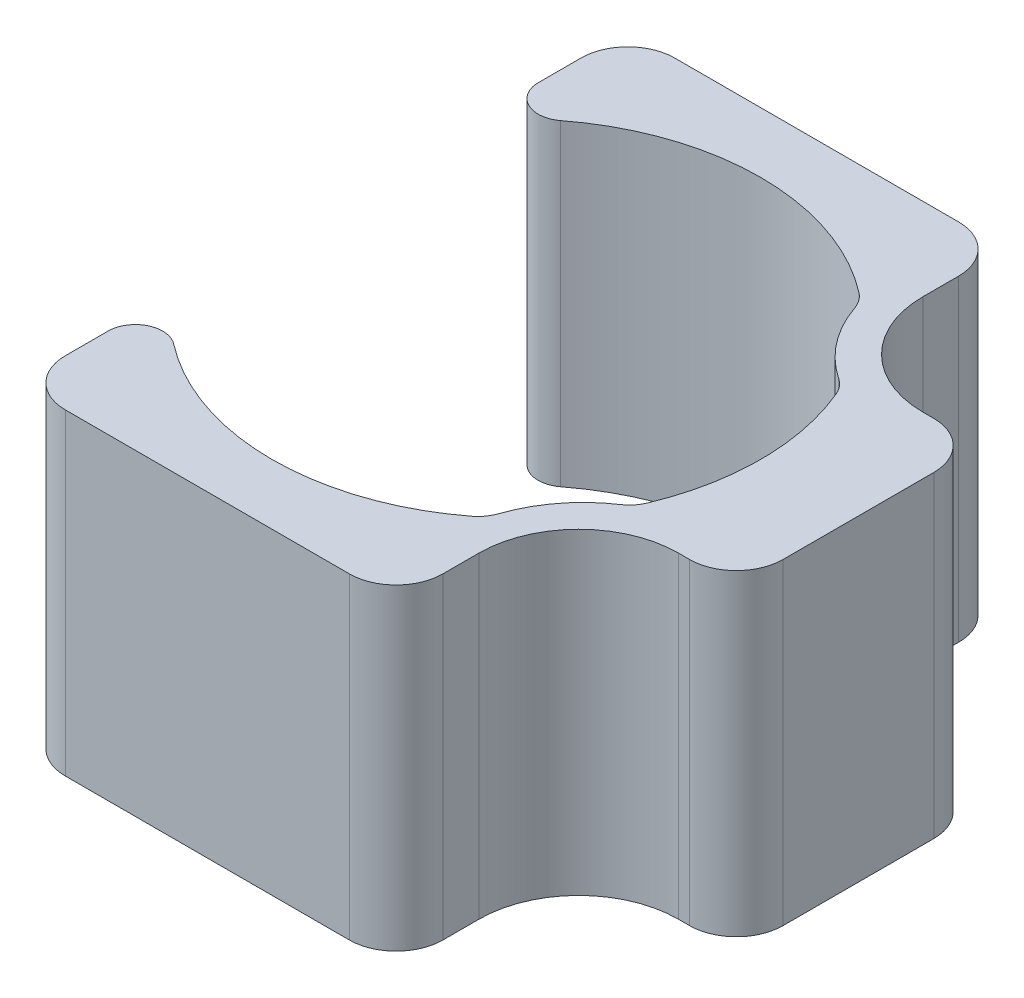
ISO-10303-21;
HEADER;
FILE_DESCRIPTION(('STEP AP214'),'2;1');
FILE_NAME('part.step','',(''),(''),'','','');
FILE_SCHEMA(('AUTOMOTIVE_DESIGN { 1 0 10303 214 1 1 1 1 }'));
ENDSEC;
DATA;
#1=APPLICATION_CONTEXT('core data for automotive mechanical design processes');
#2=APPLICATION_PROTOCOL_DEFINITION('international standard','automotive_design',2000,#1);
#3=PRODUCT_CONTEXT('',#1,'mechanical');
#4=PRODUCT('Part','Part','',(#3));
#5=PRODUCT_RELATED_PRODUCT_CATEGORY('part','',(#4));
#6=PRODUCT_DEFINITION_FORMATION('','',#4);
#7=PRODUCT_DEFINITION_CONTEXT('part definition',#1,'design');
#8=PRODUCT_DEFINITION('design','',#6,#7);
#9=PRODUCT_DEFINITION_SHAPE('','',#8);
#10=(LENGTH_UNIT() NAMED_UNIT(*) SI_UNIT(.MILLI.,.METRE.));
#11=(NAMED_UNIT(*) PLANE_ANGLE_UNIT() SI_UNIT($,.RADIAN.));
#12=(NAMED_UNIT(*) SI_UNIT($,.STERADIAN.) SOLID_ANGLE_UNIT());
#13=UNCERTAINTY_MEASURE_WITH_UNIT(LENGTH_MEASURE(1.E-05),#10,'distance_accuracy_value','');
#14=(GEOMETRIC_REPRESENTATION_CONTEXT(3) GLOBAL_UNCERTAINTY_ASSIGNED_CONTEXT((#13)) GLOBAL_UNIT_ASSIGNED_CONTEXT((#10,
#11,#12)) REPRESENTATION_CONTEXT('',''));
#15=CARTESIAN_POINT('',(0.,0.,0.));
#16=DIRECTION('',(0.,0.,1.));
#17=DIRECTION('',(1.,0.,0.));
#18=AXIS2_PLACEMENT_3D('',#15,#16,#17);
#19=CARTESIAN_POINT('',(0.,101.6,0.));
#20=DIRECTION('',(0.,-1.,0.));
#21=DIRECTION('',(0.,0.,-1.));
#22=AXIS2_PLACEMENT_3D('',#19,#20,#21);
#23=CYLINDRICAL_SURFACE('',#22,78.2759);
#24=CARTESIAN_POINT('',(0.,0.,0.));
#25=DIRECTION('',(0.,-1.,0.));
#26=DIRECTION('',(0.,0.,1.));
#27=AXIS2_PLACEMENT_3D('',#24,#25,#26);
#28=CIRCLE('',#27,78.2759);
#29=CARTESIAN_POINT('',(72.1784970981449,0.,-30.2882993491396));
#30=VERTEX_POINT('',#29);
#31=CARTESIAN_POINT('',(72.1784965519031,0.,30.2883006508604));
#32=VERTEX_POINT('',#31);
#33=EDGE_CURVE('E249',#30,#32,#28,.T.);
#34=ORIENTED_EDGE('',*,*,#33,.T.);
#35=DIRECTION('',(0.,-1.,0.));
#36=VECTOR('',#35,1.);
#37=CARTESIAN_POINT('',(72.1784965519031,101.6,30.2883006508604));
#38=LINE('',#37,#36);
#39=CARTESIAN_POINT('',(72.1784965519031,101.6,30.2883006508604));
#40=VERTEX_POINT('',#39);
#41=EDGE_CURVE('E11',#40,#32,#38,.T.);
#42=ORIENTED_EDGE('',*,*,#41,.F.);
#43=CARTESIAN_POINT('',(0.,101.6,0.));
#44=DIRECTION('',(0.,-1.,0.));
#45=DIRECTION('',(0.,0.,1.));
#46=AXIS2_PLACEMENT_3D('',#43,#44,#45);
#47=CIRCLE('',#46,78.2759);
#48=CARTESIAN_POINT('',(72.1784970981449,101.6,-30.2882993491396));
#49=VERTEX_POINT('',#48);
#50=EDGE_CURVE('E303',#49,#40,#47,.T.);
#51=ORIENTED_EDGE('',*,*,#50,.F.);
#52=DIRECTION('',(0.,-1.,0.));
#53=VECTOR('',#52,1.);
#54=CARTESIAN_POINT('',(72.1784970981449,101.6,-30.2882993491396));
#55=LINE('',#54,#53);
#56=EDGE_CURVE('E245',#49,#30,#55,.T.);
#57=ORIENTED_EDGE('',*,*,#56,.T.);
#58=EDGE_LOOP('',(#34,#42,#51,#57));
#59=FACE_BOUND('',#58,.T.);
#60=ADVANCED_FACE('F33',(#59),#23,.F.);
#61=CARTESIAN_POINT('',(62.5232795337801,101.6,26.2366768312382));
#62=DIRECTION('',(0.,-1.,0.));
#63=DIRECTION('',(0.,0.,-1.));
#64=AXIS2_PLACEMENT_3D('',#61,#62,#63);
#65=CYLINDRICAL_SURFACE('',#64,10.4708581903673);
#66=CARTESIAN_POINT('',(62.5232795337801,0.,26.2366768312382));
#67=DIRECTION('',(0.,-1.,0.));
#68=DIRECTION('',(0.,0.,-1.));
#69=AXIS2_PLACEMENT_3D('',#66,#67,#68);
#70=CIRCLE('',#69,10.4708581903673);
#71=CARTESIAN_POINT('',(68.3376978189068,0.,34.9448001220722));
#72=VERTEX_POINT('',#71);
#73=EDGE_CURVE('E252',#32,#72,#70,.T.);
#74=ORIENTED_EDGE('',*,*,#73,.T.);
#75=DIRECTION('',(0.,-1.,0.));
#76=VECTOR('',#75,1.);
#77=CARTESIAN_POINT('',(68.3376978189068,101.6,34.9448001220722));
#78=LINE('',#77,#76);
#79=CARTESIAN_POINT('',(68.3376978189068,101.6,34.9448001220722));
#80=VERTEX_POINT('',#79);
#81=EDGE_CURVE('E41',#80,#72,#78,.T.);
#82=ORIENTED_EDGE('',*,*,#81,.F.);
#83=CARTESIAN_POINT('',(62.5232795337801,101.6,26.2366768312382));
#84=DIRECTION('',(0.,-1.,0.));
#85=DIRECTION('',(0.,0.,-1.));
#86=AXIS2_PLACEMENT_3D('',#83,#84,#85);
#87=CIRCLE('',#86,10.4708581903673);
#88=EDGE_CURVE('E152',#40,#80,#87,.T.);
#89=ORIENTED_EDGE('',*,*,#88,.F.);
#90=ORIENTED_EDGE('',*,*,#41,.T.);
#91=EDGE_LOOP('',(#74,#82,#89,#90));
#92=FACE_BOUND('',#91,.T.);
#93=ADVANCED_FACE('F461',(#92),#65,.F.);
#94=CARTESIAN_POINT('',(92.5000953908635,101.6,71.1322786866904));
#95=DIRECTION('',(0.,-1.,0.));
#96=DIRECTION('',(0.,0.,-1.));
#97=AXIS2_PLACEMENT_3D('',#94,#95,#96);
#98=CYLINDRICAL_SURFACE('',#97,43.5127);
#99=CARTESIAN_POINT('',(92.5000953908635,0.,71.1322786866904));
#100=DIRECTION('',(0.,1.,0.));
#101=DIRECTION('',(0.,0.,1.));
#102=AXIS2_PLACEMENT_3D('',#99,#100,#101);
#103=CIRCLE('',#102,43.5127);
#104=CARTESIAN_POINT('',(51.3214253146733,0.,57.0726843807983));
#105=VERTEX_POINT('',#104);
#106=EDGE_CURVE('E254',#72,#105,#103,.T.);
#107=ORIENTED_EDGE('',*,*,#106,.T.);
#108=DIRECTION('',(0.,-1.,0.));
#109=VECTOR('',#108,1.);
#110=CARTESIAN_POINT('',(51.3214253146733,101.6,57.0726843807983));
#111=LINE('',#110,#109);
#112=CARTESIAN_POINT('',(51.3214253146733,101.6,57.0726843807983));
#113=VERTEX_POINT('',#112);
#114=EDGE_CURVE('E370',#113,#105,#111,.T.);
#115=ORIENTED_EDGE('',*,*,#114,.F.);
#116=CARTESIAN_POINT('',(92.5000953908635,101.6,71.1322786866904));
#117=DIRECTION('',(0.,1.,0.));
#118=DIRECTION('',(0.,0.,1.));
#119=AXIS2_PLACEMENT_3D('',#116,#117,#118);
#120=CIRCLE('',#119,43.5127);
#121=EDGE_CURVE('E378',#80,#113,#120,.T.);
#122=ORIENTED_EDGE('',*,*,#121,.F.);
#123=ORIENTED_EDGE('',*,*,#81,.T.);
#124=EDGE_LOOP('',(#107,#115,#122,#123));
#125=FACE_BOUND('',#124,.T.);
#126=ADVANCED_FACE('F376',(#125),#98,.T.);
#127=CARTESIAN_POINT('',(41.4122260501893,101.6,53.6893958652363));
#128=DIRECTION('',(0.,-1.,0.));
#129=DIRECTION('',(0.,0.,-1.));
#130=AXIS2_PLACEMENT_3D('',#127,#128,#129);
#131=CYLINDRICAL_SURFACE('',#130,10.4708581903674);
#132=CARTESIAN_POINT('',(41.4122260501893,0.,53.6893958652363));
#133=DIRECTION('',(0.,-1.,0.));
#134=DIRECTION('',(0.,0.,-1.));
#135=AXIS2_PLACEMENT_3D('',#132,#133,#134);
#136=CIRCLE('',#135,10.4708581903674);
#137=CARTESIAN_POINT('',(47.8073485181673,0.,61.9804319803637));
#138=VERTEX_POINT('',#137);
#139=EDGE_CURVE('E256',#105,#138,#136,.T.);
#140=ORIENTED_EDGE('',*,*,#139,.T.);
#141=DIRECTION('',(0.,-1.,0.));
#142=VECTOR('',#141,1.);
#143=CARTESIAN_POINT('',(47.8073485181673,101.6,61.9804319803637));
#144=LINE('',#143,#142);
#145=CARTESIAN_POINT('',(47.8073485181673,101.6,61.9804319803637));
#146=VERTEX_POINT('',#145);
#147=EDGE_CURVE('E367',#146,#138,#144,.T.);
#148=ORIENTED_EDGE('',*,*,#147,.F.);
#149=CARTESIAN_POINT('',(41.4122260501893,101.6,53.6893958652363));
#150=DIRECTION('',(0.,-1.,0.));
#151=DIRECTION('',(0.,0.,-1.));
#152=AXIS2_PLACEMENT_3D('',#149,#150,#151);
#153=CIRCLE('',#152,10.4708581903674);
#154=EDGE_CURVE('E396',#113,#146,#153,.T.);
#155=ORIENTED_EDGE('',*,*,#154,.F.);
#156=ORIENTED_EDGE('',*,*,#114,.T.);
#157=EDGE_LOOP('',(#140,#148,#155,#156));
#158=FACE_BOUND('',#157,.T.);
#159=ADVANCED_FACE('F387',(#158),#131,.F.);
#160=CARTESIAN_POINT('',(0.,101.6,0.));
#161=DIRECTION('',(0.,-1.,0.));
#162=DIRECTION('',(0.,0.,-1.));
#163=AXIS2_PLACEMENT_3D('',#160,#161,#162);
#164=CYLINDRICAL_SURFACE('',#163,78.2759);
#165=CARTESIAN_POINT('',(0.,0.,0.));
#166=DIRECTION('',(0.,-1.,0.));
#167=DIRECTION('',(0.,0.,1.));
#168=AXIS2_PLACEMENT_3D('',#165,#166,#167);
#169=CIRCLE('',#168,78.2759);
#170=CARTESIAN_POINT('',(-47.8073457048864,0.,61.9804341503307));
#171=VERTEX_POINT('',#170);
#172=EDGE_CURVE('E258',#138,#171,#169,.T.);
#173=ORIENTED_EDGE('',*,*,#172,.T.);
#174=DIRECTION('',(0.,-1.,0.));
#175=VECTOR('',#174,1.);
#176=CARTESIAN_POINT('',(-47.8073457048864,101.6,61.9804341503307));
#177=LINE('',#176,#175);
#178=CARTESIAN_POINT('',(-47.8073457048864,101.6,61.9804341503307));
#179=VERTEX_POINT('',#178);
#180=EDGE_CURVE('E364',#179,#171,#177,.T.);
#181=ORIENTED_EDGE('',*,*,#180,.F.);
#182=CARTESIAN_POINT('',(0.,101.6,0.));
#183=DIRECTION('',(0.,-1.,0.));
#184=DIRECTION('',(0.,0.,1.));
#185=AXIS2_PLACEMENT_3D('',#182,#183,#184);
#186=CIRCLE('',#185,78.2759);
#187=EDGE_CURVE('E393',#146,#179,#186,.T.);
#188=ORIENTED_EDGE('',*,*,#187,.F.);
#189=ORIENTED_EDGE('',*,*,#147,.T.);
#190=EDGE_LOOP('',(#173,#181,#188,#189));
#191=FACE_BOUND('',#190,.T.);
#192=ADVANCED_FACE('F391',(#191),#164,.F.);
#193=CARTESIAN_POINT('',(-53.1483865512864,101.6,68.9048936783295));
#194=DIRECTION('',(0.,-1.,0.));
#195=DIRECTION('',(0.,0.,-1.));
#196=AXIS2_PLACEMENT_3D('',#193,#194,#195);
#197=CYLINDRICAL_SURFACE('',#196,8.74499039895454);
#198=CARTESIAN_POINT('',(-53.1483865512864,0.,68.9048936783295));
#199=DIRECTION('',(0.,1.,0.));
#200=DIRECTION('',(0.,0.,-1.));
#201=AXIS2_PLACEMENT_3D('',#198,#199,#200);
#202=CIRCLE('',#201,8.74499039895454);
#203=CARTESIAN_POINT('',(-61.893376950241,0.,68.9048936783295));
#204=VERTEX_POINT('',#203);
#205=EDGE_CURVE('E260',#171,#204,#202,.T.);
#206=ORIENTED_EDGE('',*,*,#205,.T.);
#207=DIRECTION('',(0.,-1.,0.));
#208=VECTOR('',#207,1.);
#209=CARTESIAN_POINT('',(-61.893376950241,101.6,68.9048936783295));
#210=LINE('',#209,#208);
#211=CARTESIAN_POINT('',(-61.893376950241,101.6,68.9048936783295));
#212=VERTEX_POINT('',#211);
#213=EDGE_CURVE('E361',#212,#204,#210,.T.);
#214=ORIENTED_EDGE('',*,*,#213,.F.);
#215=CARTESIAN_POINT('',(-53.1483865512864,101.6,68.9048936783295));
#216=DIRECTION('',(0.,1.,0.));
#217=DIRECTION('',(0.,0.,-1.));
#218=AXIS2_PLACEMENT_3D('',#215,#216,#217);
#219=CIRCLE('',#218,8.74499039895454);
#220=EDGE_CURVE('E395',#179,#212,#219,.T.);
#221=ORIENTED_EDGE('',*,*,#220,.F.);
#222=ORIENTED_EDGE('',*,*,#180,.T.);
#223=EDGE_LOOP('',(#206,#214,#221,#222));
#224=FACE_BOUND('',#223,.T.);
#225=ADVANCED_FACE('F474',(#224),#197,.T.);
#226=CARTESIAN_POINT('',(-61.893376950241,101.6,82.6208936783295));
#227=DIRECTION('',(1.,0.,0.));
#228=DIRECTION('',(0.,0.,-1.));
#229=AXIS2_PLACEMENT_3D('',#226,#227,#228);
#230=PLANE('',#229);
#231=DIRECTION('',(0.,0.,1.));
#232=VECTOR('',#231,1.);
#233=CARTESIAN_POINT('',(-61.893376950241,0.,82.6208936783295));
#234=LINE('',#233,#232);
#235=CARTESIAN_POINT('',(-61.893376950241,0.,82.6208936783295));
#236=VERTEX_POINT('',#235);
#237=EDGE_CURVE('E262',#204,#236,#234,.T.);
#238=ORIENTED_EDGE('',*,*,#237,.T.);
#239=DIRECTION('',(0.,-1.,0.));
#240=VECTOR('',#239,1.);
#241=CARTESIAN_POINT('',(-61.893376950241,101.6,82.6208936783295));
#242=LINE('',#241,#240);
#243=CARTESIAN_POINT('',(-61.893376950241,101.6,82.6208936783295));
#244=VERTEX_POINT('',#243);
#245=EDGE_CURVE('E358',#244,#236,#242,.T.);
#246=ORIENTED_EDGE('',*,*,#245,.F.);
#247=DIRECTION('',(0.,0.,1.));
#248=VECTOR('',#247,1.);
#249=CARTESIAN_POINT('',(-61.893376950241,101.6,82.6208936783295));
#250=LINE('',#249,#248);
#251=EDGE_CURVE('E398',#212,#244,#250,.T.);
#252=ORIENTED_EDGE('',*,*,#251,.F.);
#253=ORIENTED_EDGE('',*,*,#213,.T.);
#254=EDGE_LOOP('',(#238,#246,#252,#253));
#255=FACE_BOUND('',#254,.T.);
#256=ADVANCED_FACE('F477',(#255),#230,.F.);
#257=CARTESIAN_POINT('',(-46.893376950241,101.6,82.6208936783295));
#258=DIRECTION('',(0.,-1.,0.));
#259=DIRECTION('',(0.,0.,-1.));
#260=AXIS2_PLACEMENT_3D('',#257,#258,#259);
#261=CYLINDRICAL_SURFACE('',#260,15.);
#262=CARTESIAN_POINT('',(-46.893376950241,0.,82.6208936783295));
#263=DIRECTION('',(0.,1.,0.));
#264=DIRECTION('',(0.,0.,-1.));
#265=AXIS2_PLACEMENT_3D('',#262,#263,#264);
#266=CIRCLE('',#265,15.);
#267=CARTESIAN_POINT('',(-46.893376950241,0.,97.6208936783295));
#268=VERTEX_POINT('',#267);
#269=EDGE_CURVE('E264',#236,#268,#266,.T.);
#270=ORIENTED_EDGE('',*,*,#269,.T.);
#271=DIRECTION('',(0.,-1.,0.));
#272=VECTOR('',#271,1.);
#273=CARTESIAN_POINT('',(-46.893376950241,101.6,97.6208936783295));
#274=LINE('',#273,#272);
#275=CARTESIAN_POINT('',(-46.893376950241,101.6,97.6208936783295));
#276=VERTEX_POINT('',#275);
#277=EDGE_CURVE('E355',#276,#268,#274,.T.);
#278=ORIENTED_EDGE('',*,*,#277,.F.);
#279=CARTESIAN_POINT('',(-46.893376950241,101.6,82.6208936783295));
#280=DIRECTION('',(0.,1.,0.));
#281=DIRECTION('',(0.,0.,-1.));
#282=AXIS2_PLACEMENT_3D('',#279,#280,#281);
#283=CIRCLE('',#282,15.);
#284=EDGE_CURVE('E404',#244,#276,#283,.T.);
#285=ORIENTED_EDGE('',*,*,#284,.F.);
#286=ORIENTED_EDGE('',*,*,#245,.T.);
#287=EDGE_LOOP('',(#270,#278,#285,#286));
#288=FACE_BOUND('',#287,.T.);
#289=ADVANCED_FACE('F481',(#288),#261,.T.);
#290=CARTESIAN_POINT('',(44.1066230497591,101.6,97.6208936783295));
#291=DIRECTION('',(0.,0.,-1.));
#292=DIRECTION('',(-1.,0.,0.));
#293=AXIS2_PLACEMENT_3D('',#290,#291,#292);
#294=PLANE('',#293);
#295=DIRECTION('',(1.,0.,0.));
#296=VECTOR('',#295,1.);
#297=CARTESIAN_POINT('',(44.1066230497591,0.,97.6208936783295));
#298=LINE('',#297,#296);
#299=CARTESIAN_POINT('',(44.1066230497591,0.,97.6208936783295));
#300=VERTEX_POINT('',#299);
#301=EDGE_CURVE('E266',#268,#300,#298,.T.);
#302=ORIENTED_EDGE('',*,*,#301,.T.);
#303=DIRECTION('',(0.,-1.,0.));
#304=VECTOR('',#303,1.);
#305=CARTESIAN_POINT('',(44.1066230497591,101.6,97.6208936783295));
#306=LINE('',#305,#304);
#307=CARTESIAN_POINT('',(44.1066230497591,101.6,97.6208936783295));
#308=VERTEX_POINT('',#307);
#309=EDGE_CURVE('E352',#308,#300,#306,.T.);
#310=ORIENTED_EDGE('',*,*,#309,.F.);
#311=DIRECTION('',(1.,0.,0.));
#312=VECTOR('',#311,1.);
#313=CARTESIAN_POINT('',(44.1066230497591,101.6,97.6208936783295));
#314=LINE('',#313,#312);
#315=EDGE_CURVE('E406',#276,#308,#314,.T.);
#316=ORIENTED_EDGE('',*,*,#315,.F.);
#317=ORIENTED_EDGE('',*,*,#277,.T.);
#318=EDGE_LOOP('',(#302,#310,#316,#317));
#319=FACE_BOUND('',#318,.T.);
#320=ADVANCED_FACE('F485',(#319),#294,.F.);
#321=CARTESIAN_POINT('',(44.1066230497591,101.6,82.6208936783295));
#322=DIRECTION('',(0.,-1.,0.));
#323=DIRECTION('',(0.,0.,-1.));
#324=AXIS2_PLACEMENT_3D('',#321,#322,#323);
#325=CYLINDRICAL_SURFACE('',#324,15.);
#326=CARTESIAN_POINT('',(44.1066230497591,0.,82.6208936783295));
#327=DIRECTION('',(0.,1.,0.));
#328=DIRECTION('',(0.,0.,1.));
#329=AXIS2_PLACEMENT_3D('',#326,#327,#328);
#330=CIRCLE('',#329,15.);
#331=CARTESIAN_POINT('',(59.106623049759,0.,82.6208936783295));
#332=VERTEX_POINT('',#331);
#333=EDGE_CURVE('E268',#300,#332,#330,.T.);
#334=ORIENTED_EDGE('',*,*,#333,.T.);
#335=DIRECTION('',(0.,-1.,0.));
#336=VECTOR('',#335,1.);
#337=CARTESIAN_POINT('',(59.106623049759,101.6,82.6208936783295));
#338=LINE('',#337,#336);
#339=CARTESIAN_POINT('',(59.106623049759,101.6,82.6208936783295));
#340=VERTEX_POINT('',#339);
#341=EDGE_CURVE('E349',#340,#332,#338,.T.);
#342=ORIENTED_EDGE('',*,*,#341,.F.);
#343=CARTESIAN_POINT('',(44.1066230497591,101.6,82.6208936783295));
#344=DIRECTION('',(0.,1.,0.));
#345=DIRECTION('',(0.,0.,1.));
#346=AXIS2_PLACEMENT_3D('',#343,#344,#345);
#347=CIRCLE('',#346,15.);
#348=EDGE_CURVE('E408',#308,#340,#347,.T.);
#349=ORIENTED_EDGE('',*,*,#348,.F.);
#350=ORIENTED_EDGE('',*,*,#309,.T.);
#351=EDGE_LOOP('',(#334,#342,#349,#350));
#352=FACE_BOUND('',#351,.T.);
#353=ADVANCED_FACE('F489',(#352),#325,.T.);
#354=CARTESIAN_POINT('',(59.106623049759,101.6,71.13235));
#355=DIRECTION('',(-1.,0.,0.));
#356=DIRECTION('',(0.,0.,1.));
#357=AXIS2_PLACEMENT_3D('',#354,#355,#356);
#358=PLANE('',#357);
#359=DIRECTION('',(0.,0.,-1.));
#360=VECTOR('',#359,1.);
#361=CARTESIAN_POINT('',(59.106623049759,0.,71.13235));
#362=LINE('',#361,#360);
#363=CARTESIAN_POINT('',(59.106623049759,0.,71.13235));
#364=VERTEX_POINT('',#363);
#365=EDGE_CURVE('E270',#332,#364,#362,.T.);
#366=ORIENTED_EDGE('',*,*,#365,.T.);
#367=DIRECTION('',(0.,-1.,0.));
#368=VECTOR('',#367,1.);
#369=CARTESIAN_POINT('',(59.106623049759,101.6,71.13235));
#370=LINE('',#369,#368);
#371=CARTESIAN_POINT('',(59.106623049759,101.6,71.13235));
#372=VERTEX_POINT('',#371);
#373=EDGE_CURVE('E346',#372,#364,#370,.T.);
#374=ORIENTED_EDGE('',*,*,#373,.F.);
#375=DIRECTION('',(0.,0.,-1.));
#376=VECTOR('',#375,1.);
#377=CARTESIAN_POINT('',(59.106623049759,101.6,71.13235));
#378=LINE('',#377,#376);
#379=EDGE_CURVE('E410',#340,#372,#378,.T.);
#380=ORIENTED_EDGE('',*,*,#379,.F.);
#381=ORIENTED_EDGE('',*,*,#341,.T.);
#382=EDGE_LOOP('',(#366,#374,#380,#381));
#383=FACE_BOUND('',#382,.T.);
#384=ADVANCED_FACE('F493',(#383),#358,.F.);
#385=CARTESIAN_POINT('',(91.106623049759,101.6,71.13235));
#386=DIRECTION('',(0.,-1.,0.));
#387=DIRECTION('',(0.,0.,-1.));
#388=AXIS2_PLACEMENT_3D('',#385,#386,#387);
#389=CYLINDRICAL_SURFACE('',#388,32.);
#390=CARTESIAN_POINT('',(91.106623049759,0.,71.13235));
#391=DIRECTION('',(0.,-1.,0.));
#392=DIRECTION('',(0.,0.,1.));
#393=AXIS2_PLACEMENT_3D('',#390,#391,#392);
#394=CIRCLE('',#393,32.);
#395=CARTESIAN_POINT('',(91.106623049759,0.,39.13235));
#396=VERTEX_POINT('',#395);
#397=EDGE_CURVE('E272',#364,#396,#394,.T.);
#398=ORIENTED_EDGE('',*,*,#397,.T.);
#399=DIRECTION('',(0.,-1.,0.));
#400=VECTOR('',#399,1.);
#401=CARTESIAN_POINT('',(91.106623049759,101.6,39.13235));
#402=LINE('',#401,#400);
#403=CARTESIAN_POINT('',(91.106623049759,101.6,39.13235));
#404=VERTEX_POINT('',#403);
#405=EDGE_CURVE('E343',#404,#396,#402,.T.);
#406=ORIENTED_EDGE('',*,*,#405,.F.);
#407=CARTESIAN_POINT('',(91.106623049759,101.6,71.13235));
#408=DIRECTION('',(0.,-1.,0.));
#409=DIRECTION('',(0.,0.,1.));
#410=AXIS2_PLACEMENT_3D('',#407,#408,#409);
#411=CIRCLE('',#410,32.);
#412=EDGE_CURVE('E412',#372,#404,#411,.T.);
#413=ORIENTED_EDGE('',*,*,#412,.F.);
#414=ORIENTED_EDGE('',*,*,#373,.T.);
#415=EDGE_LOOP('',(#398,#406,#413,#414));
#416=FACE_BOUND('',#415,.T.);
#417=ADVANCED_FACE('F497',(#416),#389,.F.);
#418=CARTESIAN_POINT('',(94.606623049759,101.6,39.13235));
#419=DIRECTION('',(0.,0.,-1.));
#420=DIRECTION('',(-1.,0.,0.));
#421=AXIS2_PLACEMENT_3D('',#418,#419,#420);
#422=PLANE('',#421);
#423=DIRECTION('',(1.,0.,0.));
#424=VECTOR('',#423,1.);
#425=CARTESIAN_POINT('',(94.606623049759,0.,39.13235));
#426=LINE('',#425,#424);
#427=CARTESIAN_POINT('',(94.606623049759,0.,39.13235));
#428=VERTEX_POINT('',#427);
#429=EDGE_CURVE('E274',#396,#428,#426,.T.);
#430=ORIENTED_EDGE('',*,*,#429,.T.);
#431=DIRECTION('',(0.,-1.,0.));
#432=VECTOR('',#431,1.);
#433=CARTESIAN_POINT('',(94.606623049759,101.6,39.13235));
#434=LINE('',#433,#432);
#435=CARTESIAN_POINT('',(94.606623049759,101.6,39.13235));
#436=VERTEX_POINT('',#435);
#437=EDGE_CURVE('E340',#436,#428,#434,.T.);
#438=ORIENTED_EDGE('',*,*,#437,.F.);
#439=DIRECTION('',(1.,0.,0.));
#440=VECTOR('',#439,1.);
#441=CARTESIAN_POINT('',(94.606623049759,101.6,39.13235));
#442=LINE('',#441,#440);
#443=EDGE_CURVE('E414',#404,#436,#442,.T.);
#444=ORIENTED_EDGE('',*,*,#443,.F.);
#445=ORIENTED_EDGE('',*,*,#405,.T.);
#446=EDGE_LOOP('',(#430,#438,#444,#445));
#447=FACE_BOUND('',#446,.T.);
#448=ADVANCED_FACE('F501',(#447),#422,.F.);
#449=CARTESIAN_POINT('',(94.606623049759,101.6,24.13235));
#450=DIRECTION('',(0.,-1.,0.));
#451=DIRECTION('',(0.,0.,-1.));
#452=AXIS2_PLACEMENT_3D('',#449,#450,#451);
#453=CYLINDRICAL_SURFACE('',#452,15.);
#454=CARTESIAN_POINT('',(94.606623049759,0.,24.13235));
#455=DIRECTION('',(0.,1.,0.));
#456=DIRECTION('',(0.,0.,-1.));
#457=AXIS2_PLACEMENT_3D('',#454,#455,#456);
#458=CIRCLE('',#457,15.);
#459=CARTESIAN_POINT('',(109.606623049759,0.,24.13235));
#460=VERTEX_POINT('',#459);
#461=EDGE_CURVE('E276',#428,#460,#458,.T.);
#462=ORIENTED_EDGE('',*,*,#461,.T.);
#463=DIRECTION('',(0.,-1.,0.));
#464=VECTOR('',#463,1.);
#465=CARTESIAN_POINT('',(109.606623049759,101.6,24.13235));
#466=LINE('',#465,#464);
#467=CARTESIAN_POINT('',(109.606623049759,101.6,24.13235));
#468=VERTEX_POINT('',#467);
#469=EDGE_CURVE('E337',#468,#460,#466,.T.);
#470=ORIENTED_EDGE('',*,*,#469,.F.);
#471=CARTESIAN_POINT('',(94.606623049759,101.6,24.13235));
#472=DIRECTION('',(0.,1.,0.));
#473=DIRECTION('',(0.,0.,-1.));
#474=AXIS2_PLACEMENT_3D('',#471,#472,#473);
#475=CIRCLE('',#474,15.);
#476=EDGE_CURVE('E416',#436,#468,#475,.T.);
#477=ORIENTED_EDGE('',*,*,#476,.F.);
#478=ORIENTED_EDGE('',*,*,#437,.T.);
#479=EDGE_LOOP('',(#462,#470,#477,#478));
#480=FACE_BOUND('',#479,.T.);
#481=ADVANCED_FACE('F505',(#480),#453,.T.);
#482=CARTESIAN_POINT('',(109.606623049759,101.6,-24.13235));
#483=DIRECTION('',(-1.,0.,0.));
#484=DIRECTION('',(0.,0.,1.));
#485=AXIS2_PLACEMENT_3D('',#482,#483,#484);
#486=PLANE('',#485);
#487=DIRECTION('',(0.,0.,-1.));
#488=VECTOR('',#487,1.);
#489=CARTESIAN_POINT('',(109.606623049759,0.,-24.13235));
#490=LINE('',#489,#488);
#491=CARTESIAN_POINT('',(109.606623049759,0.,-24.13235));
#492=VERTEX_POINT('',#491);
#493=EDGE_CURVE('E278',#460,#492,#490,.T.);
#494=ORIENTED_EDGE('',*,*,#493,.T.);
#495=DIRECTION('',(0.,-1.,0.));
#496=VECTOR('',#495,1.);
#497=CARTESIAN_POINT('',(109.606623049759,101.6,-24.13235));
#498=LINE('',#497,#496);
#499=CARTESIAN_POINT('',(109.606623049759,101.6,-24.13235));
#500=VERTEX_POINT('',#499);
#501=EDGE_CURVE('E334',#500,#492,#498,.T.);
#502=ORIENTED_EDGE('',*,*,#501,.F.);
#503=DIRECTION('',(0.,0.,-1.));
#504=VECTOR('',#503,1.);
#505=CARTESIAN_POINT('',(109.606623049759,101.6,-24.13235));
#506=LINE('',#505,#504);
#507=EDGE_CURVE('E418',#468,#500,#506,.T.);
#508=ORIENTED_EDGE('',*,*,#507,.F.);
#509=ORIENTED_EDGE('',*,*,#469,.T.);
#510=EDGE_LOOP('',(#494,#502,#508,#509));
#511=FACE_BOUND('',#510,.T.);
#512=ADVANCED_FACE('F509',(#511),#486,.F.);
#513=CARTESIAN_POINT('',(94.606623049759,101.6,-24.13235));
#514=DIRECTION('',(0.,-1.,0.));
#515=DIRECTION('',(0.,0.,-1.));
#516=AXIS2_PLACEMENT_3D('',#513,#514,#515);
#517=CYLINDRICAL_SURFACE('',#516,15.);
#518=CARTESIAN_POINT('',(94.606623049759,0.,-24.13235));
#519=DIRECTION('',(0.,1.,0.));
#520=DIRECTION('',(0.,0.,-1.));
#521=AXIS2_PLACEMENT_3D('',#518,#519,#520);
#522=CIRCLE('',#521,15.);
#523=CARTESIAN_POINT('',(94.606623049759,0.,-39.13235));
#524=VERTEX_POINT('',#523);
#525=EDGE_CURVE('E280',#492,#524,#522,.T.);
#526=ORIENTED_EDGE('',*,*,#525,.T.);
#527=DIRECTION('',(0.,-1.,0.));
#528=VECTOR('',#527,1.);
#529=CARTESIAN_POINT('',(94.606623049759,101.6,-39.13235));
#530=LINE('',#529,#528);
#531=CARTESIAN_POINT('',(94.606623049759,101.6,-39.13235));
#532=VERTEX_POINT('',#531);
#533=EDGE_CURVE('E331',#532,#524,#530,.T.);
#534=ORIENTED_EDGE('',*,*,#533,.F.);
#535=CARTESIAN_POINT('',(94.606623049759,101.6,-24.13235));
#536=DIRECTION('',(0.,1.,0.));
#537=DIRECTION('',(0.,0.,-1.));
#538=AXIS2_PLACEMENT_3D('',#535,#536,#537);
#539=CIRCLE('',#538,15.);
#540=EDGE_CURVE('E420',#500,#532,#539,.T.);
#541=ORIENTED_EDGE('',*,*,#540,.F.);
#542=ORIENTED_EDGE('',*,*,#501,.T.);
#543=EDGE_LOOP('',(#526,#534,#541,#542));
#544=FACE_BOUND('',#543,.T.);
#545=ADVANCED_FACE('F513',(#544),#517,.T.);
#546=CARTESIAN_POINT('',(91.106623049759,101.6,-39.13235));
#547=DIRECTION('',(0.,0.,1.));
#548=DIRECTION('',(1.,0.,0.));
#549=AXIS2_PLACEMENT_3D('',#546,#547,#548);
#550=PLANE('',#549);
#551=DIRECTION('',(-1.,0.,0.));
#552=VECTOR('',#551,1.);
#553=CARTESIAN_POINT('',(91.106623049759,0.,-39.13235));
#554=LINE('',#553,#552);
#555=CARTESIAN_POINT('',(91.106623049759,0.,-39.13235));
#556=VERTEX_POINT('',#555);
#557=EDGE_CURVE('E282',#524,#556,#554,.T.);
#558=ORIENTED_EDGE('',*,*,#557,.T.);
#559=DIRECTION('',(0.,-1.,0.));
#560=VECTOR('',#559,1.);
#561=CARTESIAN_POINT('',(91.106623049759,101.6,-39.13235));
#562=LINE('',#561,#560);
#563=CARTESIAN_POINT('',(91.106623049759,101.6,-39.13235));
#564=VERTEX_POINT('',#563);
#565=EDGE_CURVE('E328',#564,#556,#562,.T.);
#566=ORIENTED_EDGE('',*,*,#565,.F.);
#567=DIRECTION('',(-1.,0.,0.));
#568=VECTOR('',#567,1.);
#569=CARTESIAN_POINT('',(91.106623049759,101.6,-39.13235));
#570=LINE('',#569,#568);
#571=EDGE_CURVE('E422',#532,#564,#570,.T.);
#572=ORIENTED_EDGE('',*,*,#571,.F.);
#573=ORIENTED_EDGE('',*,*,#533,.T.);
#574=EDGE_LOOP('',(#558,#566,#572,#573));
#575=FACE_BOUND('',#574,.T.);
#576=ADVANCED_FACE('F517',(#575),#550,.F.);
#577=CARTESIAN_POINT('',(91.106623049759,101.6,-71.13235));
#578=DIRECTION('',(0.,-1.,0.));
#579=DIRECTION('',(0.,0.,-1.));
#580=AXIS2_PLACEMENT_3D('',#577,#578,#579);
#581=CYLINDRICAL_SURFACE('',#580,32.);
#582=CARTESIAN_POINT('',(91.106623049759,0.,-71.13235));
#583=DIRECTION('',(0.,-1.,0.));
#584=DIRECTION('',(0.,0.,1.));
#585=AXIS2_PLACEMENT_3D('',#582,#583,#584);
#586=CIRCLE('',#585,32.);
#587=CARTESIAN_POINT('',(59.106623049759,0.,-71.13235));
#588=VERTEX_POINT('',#587);
#589=EDGE_CURVE('E284',#556,#588,#586,.T.);
#590=ORIENTED_EDGE('',*,*,#589,.T.);
#591=DIRECTION('',(0.,-1.,0.));
#592=VECTOR('',#591,1.);
#593=CARTESIAN_POINT('',(59.106623049759,101.6,-71.13235));
#594=LINE('',#593,#592);
#595=CARTESIAN_POINT('',(59.106623049759,101.6,-71.13235));
#596=VERTEX_POINT('',#595);
#597=EDGE_CURVE('E325',#596,#588,#594,.T.);
#598=ORIENTED_EDGE('',*,*,#597,.F.);
#599=CARTESIAN_POINT('',(91.106623049759,101.6,-71.13235));
#600=DIRECTION('',(0.,-1.,0.));
#601=DIRECTION('',(0.,0.,1.));
#602=AXIS2_PLACEMENT_3D('',#599,#600,#601);
#603=CIRCLE('',#602,32.);
#604=EDGE_CURVE('E424',#564,#596,#603,.T.);
#605=ORIENTED_EDGE('',*,*,#604,.F.);
#606=ORIENTED_EDGE('',*,*,#565,.T.);
#607=EDGE_LOOP('',(#590,#598,#605,#606));
#608=FACE_BOUND('',#607,.T.);
#609=ADVANCED_FACE('F521',(#608),#581,.F.);
#610=CARTESIAN_POINT('',(59.106623049759,101.6,-82.6208936783295));
#611=DIRECTION('',(-1.,0.,0.));
#612=DIRECTION('',(0.,0.,1.));
#613=AXIS2_PLACEMENT_3D('',#610,#611,#612);
#614=PLANE('',#613);
#615=DIRECTION('',(0.,0.,-1.));
#616=VECTOR('',#615,1.);
#617=CARTESIAN_POINT('',(59.106623049759,0.,-82.6208936783295));
#618=LINE('',#617,#616);
#619=CARTESIAN_POINT('',(59.106623049759,0.,-82.6208936783295));
#620=VERTEX_POINT('',#619);
#621=EDGE_CURVE('E286',#588,#620,#618,.T.);
#622=ORIENTED_EDGE('',*,*,#621,.T.);
#623=DIRECTION('',(0.,-1.,0.));
#624=VECTOR('',#623,1.);
#625=CARTESIAN_POINT('',(59.106623049759,101.6,-82.6208936783295));
#626=LINE('',#625,#624);
#627=CARTESIAN_POINT('',(59.106623049759,101.6,-82.6208936783295));
#628=VERTEX_POINT('',#627);
#629=EDGE_CURVE('E322',#628,#620,#626,.T.);
#630=ORIENTED_EDGE('',*,*,#629,.F.);
#631=DIRECTION('',(0.,0.,-1.));
#632=VECTOR('',#631,1.);
#633=CARTESIAN_POINT('',(59.106623049759,101.6,-82.6208936783295));
#634=LINE('',#633,#632);
#635=EDGE_CURVE('E426',#596,#628,#634,.T.);
#636=ORIENTED_EDGE('',*,*,#635,.F.);
#637=ORIENTED_EDGE('',*,*,#597,.T.);
#638=EDGE_LOOP('',(#622,#630,#636,#637));
#639=FACE_BOUND('',#638,.T.);
#640=ADVANCED_FACE('F525',(#639),#614,.F.);
#641=CARTESIAN_POINT('',(44.106623049759,101.6,-82.6208936783295));
#642=DIRECTION('',(0.,-1.,0.));
#643=DIRECTION('',(0.,0.,-1.));
#644=AXIS2_PLACEMENT_3D('',#641,#642,#643);
#645=CYLINDRICAL_SURFACE('',#644,15.);
#646=CARTESIAN_POINT('',(44.106623049759,0.,-82.6208936783295));
#647=DIRECTION('',(0.,1.,0.));
#648=DIRECTION('',(0.,0.,-1.));
#649=AXIS2_PLACEMENT_3D('',#646,#647,#648);
#650=CIRCLE('',#649,15.);
#651=CARTESIAN_POINT('',(44.106623049759,0.,-97.6208936783295));
#652=VERTEX_POINT('',#651);
#653=EDGE_CURVE('E288',#620,#652,#650,.T.);
#654=ORIENTED_EDGE('',*,*,#653,.T.);
#655=DIRECTION('',(0.,-1.,0.));
#656=VECTOR('',#655,1.);
#657=CARTESIAN_POINT('',(44.106623049759,101.6,-97.6208936783295));
#658=LINE('',#657,#656);
#659=CARTESIAN_POINT('',(44.106623049759,101.6,-97.6208936783295));
#660=VERTEX_POINT('',#659);
#661=EDGE_CURVE('E319',#660,#652,#658,.T.);
#662=ORIENTED_EDGE('',*,*,#661,.F.);
#663=CARTESIAN_POINT('',(44.106623049759,101.6,-82.6208936783295));
#664=DIRECTION('',(0.,1.,0.));
#665=DIRECTION('',(0.,0.,-1.));
#666=AXIS2_PLACEMENT_3D('',#663,#664,#665);
#667=CIRCLE('',#666,15.);
#668=EDGE_CURVE('E428',#628,#660,#667,.T.);
#669=ORIENTED_EDGE('',*,*,#668,.F.);
#670=ORIENTED_EDGE('',*,*,#629,.T.);
#671=EDGE_LOOP('',(#654,#662,#669,#670));
#672=FACE_BOUND('',#671,.T.);
#673=ADVANCED_FACE('F529',(#672),#645,.T.);
#674=CARTESIAN_POINT('',(-46.893376950241,101.6,-97.6208936783295));
#675=DIRECTION('',(0.,0.,1.));
#676=DIRECTION('',(1.,0.,0.));
#677=AXIS2_PLACEMENT_3D('',#674,#675,#676);
#678=PLANE('',#677);
#679=DIRECTION('',(-1.,0.,0.));
#680=VECTOR('',#679,1.);
#681=CARTESIAN_POINT('',(-46.893376950241,0.,-97.6208936783295));
#682=LINE('',#681,#680);
#683=CARTESIAN_POINT('',(-46.893376950241,0.,-97.6208936783295));
#684=VERTEX_POINT('',#683);
#685=EDGE_CURVE('E290',#652,#684,#682,.T.);
#686=ORIENTED_EDGE('',*,*,#685,.T.);
#687=DIRECTION('',(0.,-1.,0.));
#688=VECTOR('',#687,1.);
#689=CARTESIAN_POINT('',(-46.893376950241,101.6,-97.6208936783295));
#690=LINE('',#689,#688);
#691=CARTESIAN_POINT('',(-46.893376950241,101.6,-97.6208936783295));
#692=VERTEX_POINT('',#691);
#693=EDGE_CURVE('E316',#692,#684,#690,.T.);
#694=ORIENTED_EDGE('',*,*,#693,.F.);
#695=DIRECTION('',(-1.,0.,0.));
#696=VECTOR('',#695,1.);
#697=CARTESIAN_POINT('',(-46.893376950241,101.6,-97.6208936783295));
#698=LINE('',#697,#696);
#699=EDGE_CURVE('E430',#660,#692,#698,.T.);
#700=ORIENTED_EDGE('',*,*,#699,.F.);
#701=ORIENTED_EDGE('',*,*,#661,.T.);
#702=EDGE_LOOP('',(#686,#694,#700,#701));
#703=FACE_BOUND('',#702,.T.);
#704=ADVANCED_FACE('F533',(#703),#678,.F.);
#705=CARTESIAN_POINT('',(-46.893376950241,101.6,-82.6208936783295));
#706=DIRECTION('',(0.,-1.,0.));
#707=DIRECTION('',(0.,0.,-1.));
#708=AXIS2_PLACEMENT_3D('',#705,#706,#707);
#709=CYLINDRICAL_SURFACE('',#708,15.);
#710=CARTESIAN_POINT('',(-46.893376950241,0.,-82.6208936783295));
#711=DIRECTION('',(0.,1.,0.));
#712=DIRECTION('',(0.,0.,-1.));
#713=AXIS2_PLACEMENT_3D('',#710,#711,#712);
#714=CIRCLE('',#713,15.);
#715=CARTESIAN_POINT('',(-61.893376950241,0.,-82.6208936783295));
#716=VERTEX_POINT('',#715);
#717=EDGE_CURVE('E292',#684,#716,#714,.T.);
#718=ORIENTED_EDGE('',*,*,#717,.T.);
#719=DIRECTION('',(0.,-1.,0.));
#720=VECTOR('',#719,1.);
#721=CARTESIAN_POINT('',(-61.893376950241,101.6,-82.6208936783295));
#722=LINE('',#721,#720);
#723=CARTESIAN_POINT('',(-61.893376950241,101.6,-82.6208936783295));
#724=VERTEX_POINT('',#723);
#725=EDGE_CURVE('E313',#724,#716,#722,.T.);
#726=ORIENTED_EDGE('',*,*,#725,.F.);
#727=CARTESIAN_POINT('',(-46.893376950241,101.6,-82.6208936783295));
#728=DIRECTION('',(0.,1.,0.));
#729=DIRECTION('',(0.,0.,-1.));
#730=AXIS2_PLACEMENT_3D('',#727,#728,#729);
#731=CIRCLE('',#730,15.);
#732=EDGE_CURVE('E432',#692,#724,#731,.T.);
#733=ORIENTED_EDGE('',*,*,#732,.F.);
#734=ORIENTED_EDGE('',*,*,#693,.T.);
#735=EDGE_LOOP('',(#718,#726,#733,#734));
#736=FACE_BOUND('',#735,.T.);
#737=ADVANCED_FACE('F537',(#736),#709,.T.);
#738=CARTESIAN_POINT('',(-61.893376950241,101.6,-68.9048936783295));
#739=DIRECTION('',(1.,0.,0.));
#740=DIRECTION('',(0.,0.,-1.));
#741=AXIS2_PLACEMENT_3D('',#738,#739,#740);
#742=PLANE('',#741);
#743=DIRECTION('',(0.,0.,1.));
#744=VECTOR('',#743,1.);
#745=CARTESIAN_POINT('',(-61.893376950241,0.,-68.9048936783295));
#746=LINE('',#745,#744);
#747=CARTESIAN_POINT('',(-61.893376950241,0.,-68.9048936783295));
#748=VERTEX_POINT('',#747);
#749=EDGE_CURVE('E294',#716,#748,#746,.T.);
#750=ORIENTED_EDGE('',*,*,#749,.T.);
#751=DIRECTION('',(0.,-1.,0.));
#752=VECTOR('',#751,1.);
#753=CARTESIAN_POINT('',(-61.893376950241,101.6,-68.9048936783295));
#754=LINE('',#753,#752);
#755=CARTESIAN_POINT('',(-61.893376950241,101.6,-68.9048936783295));
#756=VERTEX_POINT('',#755);
#757=EDGE_CURVE('E310',#756,#748,#754,.T.);
#758=ORIENTED_EDGE('',*,*,#757,.F.);
#759=DIRECTION('',(0.,0.,1.));
#760=VECTOR('',#759,1.);
#761=CARTESIAN_POINT('',(-61.893376950241,101.6,-68.9048936783295));
#762=LINE('',#761,#760);
#763=EDGE_CURVE('E434',#724,#756,#762,.T.);
#764=ORIENTED_EDGE('',*,*,#763,.F.);
#765=ORIENTED_EDGE('',*,*,#725,.T.);
#766=EDGE_LOOP('',(#750,#758,#764,#765));
#767=FACE_BOUND('',#766,.T.);
#768=ADVANCED_FACE('F541',(#767),#742,.F.);
#769=CARTESIAN_POINT('',(-53.1483865512864,101.6,-68.9048936783295));
#770=DIRECTION('',(0.,-1.,0.));
#771=DIRECTION('',(0.,0.,-1.));
#772=AXIS2_PLACEMENT_3D('',#769,#770,#771);
#773=CYLINDRICAL_SURFACE('',#772,8.74499039895453);
#774=CARTESIAN_POINT('',(-53.1483865512864,0.,-68.9048936783295));
#775=DIRECTION('',(0.,1.,0.));
#776=DIRECTION('',(0.,0.,-1.));
#777=AXIS2_PLACEMENT_3D('',#774,#775,#776);
#778=CIRCLE('',#777,8.74499039895453);
#779=CARTESIAN_POINT('',(-47.8073457048863,0.,-61.9804341503308));
#780=VERTEX_POINT('',#779);
#781=EDGE_CURVE('E296',#748,#780,#778,.T.);
#782=ORIENTED_EDGE('',*,*,#781,.T.);
#783=DIRECTION('',(0.,-1.,0.));
#784=VECTOR('',#783,1.);
#785=CARTESIAN_POINT('',(-47.8073457048863,101.6,-61.9804341503308));
#786=LINE('',#785,#784);
#787=CARTESIAN_POINT('',(-47.8073457048863,101.6,-61.9804341503308));
#788=VERTEX_POINT('',#787);
#789=EDGE_CURVE('E307',#788,#780,#786,.T.);
#790=ORIENTED_EDGE('',*,*,#789,.F.);
#791=CARTESIAN_POINT('',(-53.1483865512864,101.6,-68.9048936783295));
#792=DIRECTION('',(0.,1.,0.));
#793=DIRECTION('',(0.,0.,-1.));
#794=AXIS2_PLACEMENT_3D('',#791,#792,#793);
#795=CIRCLE('',#794,8.74499039895453);
#796=EDGE_CURVE('E436',#756,#788,#795,.T.);
#797=ORIENTED_EDGE('',*,*,#796,.F.);
#798=ORIENTED_EDGE('',*,*,#757,.T.);
#799=EDGE_LOOP('',(#782,#790,#797,#798));
#800=FACE_BOUND('',#799,.T.);
#801=ADVANCED_FACE('F442',(#800),#773,.T.);
#802=CARTESIAN_POINT('',(0.,101.6,0.));
#803=DIRECTION('',(0.,-1.,0.));
#804=DIRECTION('',(0.,0.,-1.));
#805=AXIS2_PLACEMENT_3D('',#802,#803,#804);
#806=CYLINDRICAL_SURFACE('',#805,78.2759);
#807=CARTESIAN_POINT('',(0.,0.,0.));
#808=DIRECTION('',(0.,-1.,0.));
#809=DIRECTION('',(0.,0.,1.));
#810=AXIS2_PLACEMENT_3D('',#807,#808,#809);
#811=CIRCLE('',#810,78.2759);
#812=CARTESIAN_POINT('',(47.8073457048864,0.,-61.9804341503307));
#813=VERTEX_POINT('',#812);
#814=EDGE_CURVE('E298',#780,#813,#811,.T.);
#815=ORIENTED_EDGE('',*,*,#814,.T.);
#816=DIRECTION('',(0.,-1.,0.));
#817=VECTOR('',#816,1.);
#818=CARTESIAN_POINT('',(47.8073457048864,101.6,-61.9804341503307));
#819=LINE('',#818,#817);
#820=CARTESIAN_POINT('',(47.8073457048864,101.6,-61.9804341503307));
#821=VERTEX_POINT('',#820);
#822=EDGE_CURVE('E240',#821,#813,#819,.T.);
#823=ORIENTED_EDGE('',*,*,#822,.F.);
#824=CARTESIAN_POINT('',(0.,101.6,0.));
#825=DIRECTION('',(0.,-1.,0.));
#826=DIRECTION('',(0.,0.,1.));
#827=AXIS2_PLACEMENT_3D('',#824,#825,#826);
#828=CIRCLE('',#827,78.2759);
#829=EDGE_CURVE('E231',#788,#821,#828,.T.);
#830=ORIENTED_EDGE('',*,*,#829,.F.);
#831=ORIENTED_EDGE('',*,*,#789,.T.);
#832=EDGE_LOOP('',(#815,#823,#830,#831));
#833=FACE_BOUND('',#832,.T.);
#834=ADVANCED_FACE('F446',(#833),#806,.F.);
#835=CARTESIAN_POINT('',(41.412223613237,101.6,-53.6893977449299));
#836=DIRECTION('',(0.,-1.,0.));
#837=DIRECTION('',(0.,0.,-1.));
#838=AXIS2_PLACEMENT_3D('',#835,#836,#837);
#839=CYLINDRICAL_SURFACE('',#838,10.4708581903673);
#840=CARTESIAN_POINT('',(41.412223613237,0.,-53.6893977449299));
#841=DIRECTION('',(0.,-1.,0.));
#842=DIRECTION('',(0.,0.,-1.));
#843=AXIS2_PLACEMENT_3D('',#840,#841,#842);
#844=CIRCLE('',#843,10.4708581903673);
#845=CARTESIAN_POINT('',(51.321422969008,0.,-57.0726859931243));
#846=VERTEX_POINT('',#845);
#847=EDGE_CURVE('E239',#813,#846,#844,.T.);
#848=ORIENTED_EDGE('',*,*,#847,.T.);
#849=DIRECTION('',(0.,-1.,0.));
#850=VECTOR('',#849,1.);
#851=CARTESIAN_POINT('',(51.321422969008,101.6,-57.0726859931243));
#852=LINE('',#851,#850);
#853=CARTESIAN_POINT('',(51.321422969008,101.6,-57.0726859931243));
#854=VERTEX_POINT('',#853);
#855=EDGE_CURVE('E236',#854,#846,#852,.T.);
#856=ORIENTED_EDGE('',*,*,#855,.F.);
#857=CARTESIAN_POINT('',(41.412223613237,101.6,-53.6893977449299));
#858=DIRECTION('',(0.,-1.,0.));
#859=DIRECTION('',(0.,0.,-1.));
#860=AXIS2_PLACEMENT_3D('',#857,#858,#859);
#861=CIRCLE('',#860,10.4708581903673);
#862=EDGE_CURVE('E225',#821,#854,#861,.T.);
#863=ORIENTED_EDGE('',*,*,#862,.F.);
#864=ORIENTED_EDGE('',*,*,#822,.T.);
#865=EDGE_LOOP('',(#848,#856,#863,#864));
#866=FACE_BOUND('',#865,.T.);
#867=ADVANCED_FACE('F237',(#866),#839,.F.);
#868=CARTESIAN_POINT('',(92.5000934245507,101.6,-71.132279187944));
#869=DIRECTION('',(0.,-1.,0.));
#870=DIRECTION('',(0.,0.,-1.));
#871=AXIS2_PLACEMENT_3D('',#868,#869,#870);
#872=CYLINDRICAL_SURFACE('',#871,43.5127);
#873=CARTESIAN_POINT('',(92.5000934245507,0.,-71.132279187944));
#874=DIRECTION('',(0.,1.,0.));
#875=DIRECTION('',(0.,0.,1.));
#876=AXIS2_PLACEMENT_3D('',#873,#874,#875);
#877=CIRCLE('',#876,43.5127);
#878=CARTESIAN_POINT('',(68.3376978189068,0.,-34.9447993104178));
#879=VERTEX_POINT('',#878);
#880=EDGE_CURVE('E138',#846,#879,#877,.T.);
#881=ORIENTED_EDGE('',*,*,#880,.T.);
#882=DIRECTION('',(0.,-1.,0.));
#883=VECTOR('',#882,1.);
#884=CARTESIAN_POINT('',(68.3376978189068,101.6,-34.9447993104178));
#885=LINE('',#884,#883);
#886=CARTESIAN_POINT('',(68.3376978189068,101.6,-34.9447993104178));
#887=VERTEX_POINT('',#886);
#888=EDGE_CURVE('E241',#887,#879,#885,.T.);
#889=ORIENTED_EDGE('',*,*,#888,.F.);
#890=CARTESIAN_POINT('',(92.5000934245507,101.6,-71.132279187944));
#891=DIRECTION('',(0.,1.,0.));
#892=DIRECTION('',(0.,0.,1.));
#893=AXIS2_PLACEMENT_3D('',#890,#891,#892);
#894=CIRCLE('',#893,43.5127);
#895=EDGE_CURVE('E229',#854,#887,#894,.T.);
#896=ORIENTED_EDGE('',*,*,#895,.F.);
#897=ORIENTED_EDGE('',*,*,#855,.T.);
#898=EDGE_LOOP('',(#881,#889,#896,#897));
#899=FACE_BOUND('',#898,.T.);
#900=ADVANCED_FACE('F243',(#899),#872,.T.);
#901=CARTESIAN_POINT('',(62.5232800069519,101.6,-26.2366757036467));
#902=DIRECTION('',(0.,-1.,0.));
#903=DIRECTION('',(0.,0.,-1.));
#904=AXIS2_PLACEMENT_3D('',#901,#902,#903);
#905=CYLINDRICAL_SURFACE('',#904,10.4708581903673);
#906=CARTESIAN_POINT('',(62.5232800069519,0.,-26.2366757036467));
#907=DIRECTION('',(0.,-1.,0.));
#908=DIRECTION('',(0.,0.,-1.));
#909=AXIS2_PLACEMENT_3D('',#906,#907,#908);
#910=CIRCLE('',#909,10.4708581903673);
#911=EDGE_CURVE('E144',#879,#30,#910,.T.);
#912=ORIENTED_EDGE('',*,*,#911,.T.);
#913=ORIENTED_EDGE('',*,*,#56,.F.);
#914=CARTESIAN_POINT('',(62.5232800069519,101.6,-26.2366757036467));
#915=DIRECTION('',(0.,-1.,0.));
#916=DIRECTION('',(0.,0.,-1.));
#917=AXIS2_PLACEMENT_3D('',#914,#915,#916);
#918=CIRCLE('',#917,10.4708581903673);
#919=EDGE_CURVE('E49',#887,#49,#918,.T.);
#920=ORIENTED_EDGE('',*,*,#919,.F.);
#921=ORIENTED_EDGE('',*,*,#888,.T.);
#922=EDGE_LOOP('',(#912,#913,#920,#921));
#923=FACE_BOUND('',#922,.T.);
#924=ADVANCED_FACE('F450',(#923),#905,.F.);
#925=CARTESIAN_POINT('',(0.,101.6,0.));
#926=DIRECTION('',(0.,1.,0.));
#927=DIRECTION('',(0.,0.,1.));
#928=AXIS2_PLACEMENT_3D('',#925,#926,#927);
#929=PLANE('',#928);
#930=ORIENTED_EDGE('',*,*,#50,.T.);
#931=ORIENTED_EDGE('',*,*,#88,.T.);
#932=ORIENTED_EDGE('',*,*,#121,.T.);
#933=ORIENTED_EDGE('',*,*,#154,.T.);
#934=ORIENTED_EDGE('',*,*,#187,.T.);
#935=ORIENTED_EDGE('',*,*,#220,.T.);
#936=ORIENTED_EDGE('',*,*,#251,.T.);
#937=ORIENTED_EDGE('',*,*,#284,.T.);
#938=ORIENTED_EDGE('',*,*,#315,.T.);
#939=ORIENTED_EDGE('',*,*,#348,.T.);
#940=ORIENTED_EDGE('',*,*,#379,.T.);
#941=ORIENTED_EDGE('',*,*,#412,.T.);
#942=ORIENTED_EDGE('',*,*,#443,.T.);
#943=ORIENTED_EDGE('',*,*,#476,.T.);
#944=ORIENTED_EDGE('',*,*,#507,.T.);
#945=ORIENTED_EDGE('',*,*,#540,.T.);
#946=ORIENTED_EDGE('',*,*,#571,.T.);
#947=ORIENTED_EDGE('',*,*,#604,.T.);
#948=ORIENTED_EDGE('',*,*,#635,.T.);
#949=ORIENTED_EDGE('',*,*,#668,.T.);
#950=ORIENTED_EDGE('',*,*,#699,.T.);
#951=ORIENTED_EDGE('',*,*,#732,.T.);
#952=ORIENTED_EDGE('',*,*,#763,.T.);
#953=ORIENTED_EDGE('',*,*,#796,.T.);
#954=ORIENTED_EDGE('',*,*,#829,.T.);
#955=ORIENTED_EDGE('',*,*,#862,.T.);
#956=ORIENTED_EDGE('',*,*,#895,.T.);
#957=ORIENTED_EDGE('',*,*,#919,.T.);
#958=EDGE_LOOP('',(#930,#931,#932,#933,#934,#935,#936,#937,#938,#939,#940,#941,#942,#943,#944,
#945,#946,#947,#948,#949,#950,#951,#952,#953,#954,#955,#956,#957));
#959=FACE_BOUND('',#958,.T.);
#960=ADVANCED_FACE('F227',(#959),#929,.T.);
#961=CARTESIAN_POINT('',(0.,0.,0.));
#962=DIRECTION('',(0.,1.,0.));
#963=DIRECTION('',(0.,0.,1.));
#964=AXIS2_PLACEMENT_3D('',#961,#962,#963);
#965=PLANE('',#964);
#966=ORIENTED_EDGE('',*,*,#33,.F.);
#967=ORIENTED_EDGE('',*,*,#911,.F.);
#968=ORIENTED_EDGE('',*,*,#880,.F.);
#969=ORIENTED_EDGE('',*,*,#847,.F.);
#970=ORIENTED_EDGE('',*,*,#814,.F.);
#971=ORIENTED_EDGE('',*,*,#781,.F.);
#972=ORIENTED_EDGE('',*,*,#749,.F.);
#973=ORIENTED_EDGE('',*,*,#717,.F.);
#974=ORIENTED_EDGE('',*,*,#685,.F.);
#975=ORIENTED_EDGE('',*,*,#653,.F.);
#976=ORIENTED_EDGE('',*,*,#621,.F.);
#977=ORIENTED_EDGE('',*,*,#589,.F.);
#978=ORIENTED_EDGE('',*,*,#557,.F.);
#979=ORIENTED_EDGE('',*,*,#525,.F.);
#980=ORIENTED_EDGE('',*,*,#493,.F.);
#981=ORIENTED_EDGE('',*,*,#461,.F.);
#982=ORIENTED_EDGE('',*,*,#429,.F.);
#983=ORIENTED_EDGE('',*,*,#397,.F.);
#984=ORIENTED_EDGE('',*,*,#365,.F.);
#985=ORIENTED_EDGE('',*,*,#333,.F.);
#986=ORIENTED_EDGE('',*,*,#301,.F.);
#987=ORIENTED_EDGE('',*,*,#269,.F.);
#988=ORIENTED_EDGE('',*,*,#237,.F.);
#989=ORIENTED_EDGE('',*,*,#205,.F.);
#990=ORIENTED_EDGE('',*,*,#172,.F.);
#991=ORIENTED_EDGE('',*,*,#139,.F.);
#992=ORIENTED_EDGE('',*,*,#106,.F.);
#993=ORIENTED_EDGE('',*,*,#73,.F.);
#994=EDGE_LOOP('',(#966,#967,#968,#969,#970,#971,#972,#973,#974,#975,#976,#977,#978,#979,#980,
#981,#982,#983,#984,#985,#986,#987,#988,#989,#990,#991,#992,#993));
#995=FACE_BOUND('',#994,.T.);
#996=ADVANCED_FACE('F382',(#995),#965,.F.);
#997=CLOSED_SHELL('',(#60,#93,#126,#159,#192,#225,#256,#289,#320,#353,#384,#417,#448,#481,#512,
#545,#576,#609,#640,#673,#704,#737,#768,#801,#834,#867,#900,#924,#960,#996));
#998=MANIFOLD_SOLID_BREP('B2',#997);
#999=ADVANCED_BREP_SHAPE_REPRESENTATION('',(#18,#998),#14);
#1000=SHAPE_DEFINITION_REPRESENTATION(#9,#999);
ENDSEC;
END-ISO-10303-21;
